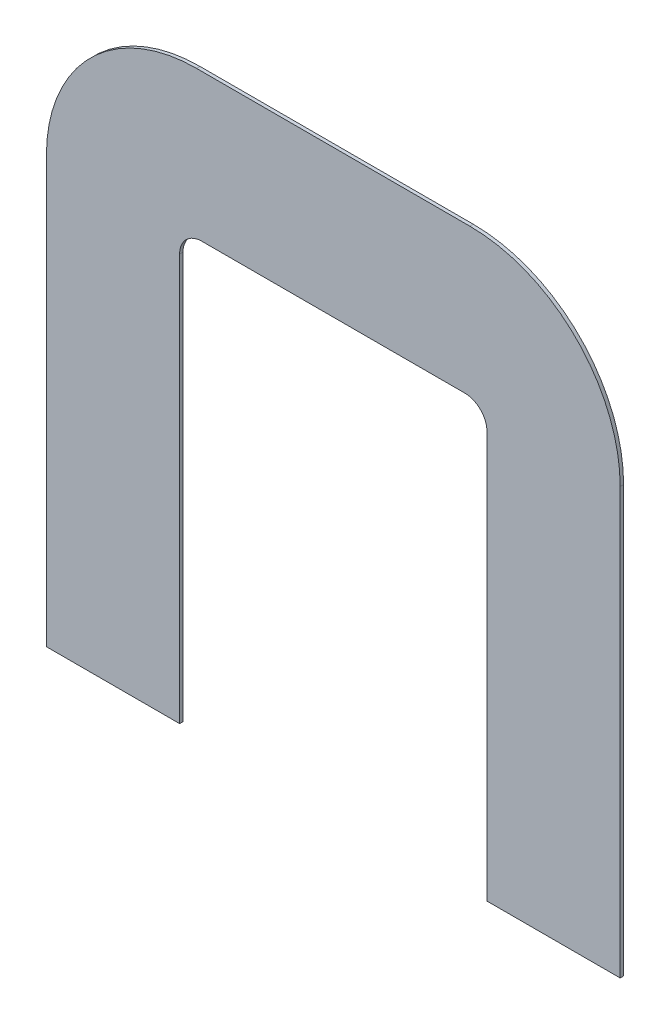
ISO-10303-21;
HEADER;
FILE_DESCRIPTION(('STEP AP214'),'2;1');
FILE_NAME('part.step','',(''),(''),'','','');
FILE_SCHEMA(('AUTOMOTIVE_DESIGN { 1 0 10303 214 1 1 1 1 }'));
ENDSEC;
DATA;
#1=APPLICATION_CONTEXT('core data for automotive mechanical design processes');
#2=APPLICATION_PROTOCOL_DEFINITION('international standard','automotive_design',2000,#1);
#3=PRODUCT_CONTEXT('',#1,'mechanical');
#4=PRODUCT('Part','Part','',(#3));
#5=PRODUCT_RELATED_PRODUCT_CATEGORY('part','',(#4));
#6=PRODUCT_DEFINITION_FORMATION('','',#4);
#7=PRODUCT_DEFINITION_CONTEXT('part definition',#1,'design');
#8=PRODUCT_DEFINITION('design','',#6,#7);
#9=PRODUCT_DEFINITION_SHAPE('','',#8);
#10=(LENGTH_UNIT() NAMED_UNIT(*) SI_UNIT(.MILLI.,.METRE.));
#11=(NAMED_UNIT(*) PLANE_ANGLE_UNIT() SI_UNIT($,.RADIAN.));
#12=(NAMED_UNIT(*) SI_UNIT($,.STERADIAN.) SOLID_ANGLE_UNIT());
#13=UNCERTAINTY_MEASURE_WITH_UNIT(LENGTH_MEASURE(1.E-05),#10,'distance_accuracy_value','');
#14=(GEOMETRIC_REPRESENTATION_CONTEXT(3) GLOBAL_UNCERTAINTY_ASSIGNED_CONTEXT((#13)) GLOBAL_UNIT_ASSIGNED_CONTEXT((#10,
#11,#12)) REPRESENTATION_CONTEXT('',''));
#15=CARTESIAN_POINT('',(0.,0.,0.));
#16=DIRECTION('',(0.,0.,1.));
#17=DIRECTION('',(1.,0.,0.));
#18=AXIS2_PLACEMENT_3D('',#15,#16,#17);
#19=CARTESIAN_POINT('',(2.164534045054,-16.64756050284,0.01));
#20=DIRECTION('',(0.,0.,1.));
#21=DIRECTION('',(1.,0.,0.));
#22=AXIS2_PLACEMENT_3D('',#19,#20,#21);
#23=PLANE('',#22);
#24=DIRECTION('',(0.,-1.,0.));
#25=VECTOR('',#24,1.);
#26=CARTESIAN_POINT('',(3.004534045054,-16.26704437193,0.01));
#27=LINE('',#26,#25);
#28=CARTESIAN_POINT('',(3.004534045054,-16.26704437193,0.01));
#29=VERTEX_POINT('',#28);
#30=CARTESIAN_POINT('',(3.004534045054,-17.5134,0.01));
#31=VERTEX_POINT('',#30);
#32=EDGE_CURVE('E385',#29,#31,#27,.T.);
#33=ORIENTED_EDGE('',*,*,#32,.F.);
#34=CARTESIAN_POINT('',(2.564534045054,-16.26704437193,0.01));
#35=DIRECTION('',(0.,0.,1.));
#36=DIRECTION('',(1.,0.,0.));
#37=AXIS2_PLACEMENT_3D('',#34,#35,#36);
#38=CIRCLE('',#37,0.44);
#39=CARTESIAN_POINT('',(2.564534045054,-15.82704437193,0.01));
#40=VERTEX_POINT('',#39);
#41=EDGE_CURVE('E11',#29,#40,#38,.T.);
#42=ORIENTED_EDGE('',*,*,#41,.T.);
#43=DIRECTION('',(1.,0.,0.));
#44=VECTOR('',#43,1.);
#45=CARTESIAN_POINT('',(1.764534045054,-15.82704437193,0.01));
#46=LINE('',#45,#44);
#47=CARTESIAN_POINT('',(1.764534045054,-15.82704437193,0.01));
#48=VERTEX_POINT('',#47);
#49=EDGE_CURVE('E220',#48,#40,#46,.T.);
#50=ORIENTED_EDGE('',*,*,#49,.F.);
#51=CARTESIAN_POINT('',(1.764534045054,-16.26704437193,0.01));
#52=DIRECTION('',(0.,0.,1.));
#53=DIRECTION('',(1.,0.,0.));
#54=AXIS2_PLACEMENT_3D('',#51,#52,#53);
#55=CIRCLE('',#54,0.44);
#56=CARTESIAN_POINT('',(1.324534045054,-16.26704437193,0.01));
#57=VERTEX_POINT('',#56);
#58=EDGE_CURVE('E217',#48,#57,#55,.T.);
#59=ORIENTED_EDGE('',*,*,#58,.T.);
#60=DIRECTION('',(0.,1.,0.));
#61=VECTOR('',#60,1.);
#62=CARTESIAN_POINT('',(1.324534045054,-17.5134,0.01));
#63=LINE('',#62,#61);
#64=CARTESIAN_POINT('',(1.324534045054,-17.5134,0.01));
#65=VERTEX_POINT('',#64);
#66=EDGE_CURVE('E201',#65,#57,#63,.T.);
#67=ORIENTED_EDGE('',*,*,#66,.F.);
#68=DIRECTION('',(-1.,0.,0.));
#69=VECTOR('',#68,1.);
#70=CARTESIAN_POINT('',(1.714534045054,-17.5134,0.01));
#71=LINE('',#70,#69);
#72=CARTESIAN_POINT('',(1.714534045054,-17.5134,0.01));
#73=VERTEX_POINT('',#72);
#74=EDGE_CURVE('E189',#73,#65,#71,.T.);
#75=ORIENTED_EDGE('',*,*,#74,.F.);
#76=DIRECTION('',(0.,-1.,0.));
#77=VECTOR('',#76,1.);
#78=CARTESIAN_POINT('',(1.714534045054,-16.32268295804,0.01));
#79=LINE('',#78,#77);
#80=CARTESIAN_POINT('',(1.714534045054,-16.32268295804,0.01));
#81=VERTEX_POINT('',#80);
#82=EDGE_CURVE('E180',#81,#73,#79,.T.);
#83=ORIENTED_EDGE('',*,*,#82,.F.);
#84=CARTESIAN_POINT('',(1.779534045054,-16.32268295804,0.01));
#85=DIRECTION('',(0.,0.,1.));
#86=DIRECTION('',(1.,0.,0.));
#87=AXIS2_PLACEMENT_3D('',#84,#85,#86);
#88=CIRCLE('',#87,0.065);
#89=CARTESIAN_POINT('',(1.779534045054,-16.25768295804,0.01));
#90=VERTEX_POINT('',#89);
#91=EDGE_CURVE('E137',#90,#81,#88,.T.);
#92=ORIENTED_EDGE('',*,*,#91,.F.);
#93=DIRECTION('',(-1.,0.,0.));
#94=VECTOR('',#93,1.);
#95=CARTESIAN_POINT('',(2.549534045054,-16.25768295804,0.01));
#96=LINE('',#95,#94);
#97=CARTESIAN_POINT('',(2.549534045054,-16.25768295804,0.01));
#98=VERTEX_POINT('',#97);
#99=EDGE_CURVE('E131',#98,#90,#96,.T.);
#100=ORIENTED_EDGE('',*,*,#99,.F.);
#101=CARTESIAN_POINT('',(2.549534045054,-16.32268295804,0.01));
#102=DIRECTION('',(0.,0.,1.));
#103=DIRECTION('',(1.,0.,0.));
#104=AXIS2_PLACEMENT_3D('',#101,#102,#103);
#105=CIRCLE('',#104,0.065);
#106=CARTESIAN_POINT('',(2.614534045054,-16.32268295804,0.01));
#107=VERTEX_POINT('',#106);
#108=EDGE_CURVE('E134',#107,#98,#105,.T.);
#109=ORIENTED_EDGE('',*,*,#108,.F.);
#110=DIRECTION('',(0.,1.,0.));
#111=VECTOR('',#110,1.);
#112=CARTESIAN_POINT('',(2.614534045054,-17.5134,0.01));
#113=LINE('',#112,#111);
#114=CARTESIAN_POINT('',(2.614534045054,-17.5134,0.01));
#115=VERTEX_POINT('',#114);
#116=EDGE_CURVE('E169',#115,#107,#113,.T.);
#117=ORIENTED_EDGE('',*,*,#116,.F.);
#118=DIRECTION('',(-1.,0.,0.));
#119=VECTOR('',#118,1.);
#120=CARTESIAN_POINT('',(3.004534045054,-17.5134,0.01));
#121=LINE('',#120,#119);
#122=EDGE_CURVE('E380',#31,#115,#121,.T.);
#123=ORIENTED_EDGE('',*,*,#122,.F.);
#124=EDGE_LOOP('',(#33,#42,#50,#59,#67,#75,#83,#92,#100,#109,#117,#123));
#125=FACE_BOUND('',#124,.T.);
#126=ADVANCED_FACE('F17',(#125),#23,.T.);
#127=CARTESIAN_POINT('',(2.164534045054,-16.64756050284,0.));
#128=DIRECTION('',(0.,0.,1.));
#129=DIRECTION('',(1.,0.,0.));
#130=AXIS2_PLACEMENT_3D('',#127,#128,#129);
#131=PLANE('',#130);
#132=DIRECTION('',(0.,-1.,0.));
#133=VECTOR('',#132,1.);
#134=CARTESIAN_POINT('',(3.004534045054,-16.26704437193,0.));
#135=LINE('',#134,#133);
#136=CARTESIAN_POINT('',(3.004534045054,-16.26704437193,0.));
#137=VERTEX_POINT('',#136);
#138=CARTESIAN_POINT('',(3.004534045054,-17.5134,0.));
#139=VERTEX_POINT('',#138);
#140=EDGE_CURVE('E374',#137,#139,#135,.T.);
#141=ORIENTED_EDGE('',*,*,#140,.T.);
#142=DIRECTION('',(-1.,0.,0.));
#143=VECTOR('',#142,1.);
#144=CARTESIAN_POINT('',(3.004534045054,-17.5134,0.));
#145=LINE('',#144,#143);
#146=CARTESIAN_POINT('',(2.614534045054,-17.5134,0.));
#147=VERTEX_POINT('',#146);
#148=EDGE_CURVE('E376',#139,#147,#145,.T.);
#149=ORIENTED_EDGE('',*,*,#148,.T.);
#150=DIRECTION('',(0.,1.,0.));
#151=VECTOR('',#150,1.);
#152=CARTESIAN_POINT('',(2.614534045054,-17.5134,0.));
#153=LINE('',#152,#151);
#154=CARTESIAN_POINT('',(2.614534045054,-16.32268295804,0.));
#155=VERTEX_POINT('',#154);
#156=EDGE_CURVE('E159',#147,#155,#153,.T.);
#157=ORIENTED_EDGE('',*,*,#156,.T.);
#158=CARTESIAN_POINT('',(2.549534045054,-16.32268295804,0.));
#159=DIRECTION('',(0.,0.,1.));
#160=DIRECTION('',(1.,0.,0.));
#161=AXIS2_PLACEMENT_3D('',#158,#159,#160);
#162=CIRCLE('',#161,0.065);
#163=CARTESIAN_POINT('',(2.549534045054,-16.25768295804,0.));
#164=VERTEX_POINT('',#163);
#165=EDGE_CURVE('E143',#155,#164,#162,.T.);
#166=ORIENTED_EDGE('',*,*,#165,.T.);
#167=DIRECTION('',(-1.,0.,0.));
#168=VECTOR('',#167,1.);
#169=CARTESIAN_POINT('',(2.549534045054,-16.25768295804,0.));
#170=LINE('',#169,#168);
#171=CARTESIAN_POINT('',(1.779534045054,-16.25768295804,0.));
#172=VERTEX_POINT('',#171);
#173=EDGE_CURVE('E149',#164,#172,#170,.T.);
#174=ORIENTED_EDGE('',*,*,#173,.T.);
#175=CARTESIAN_POINT('',(1.779534045054,-16.32268295804,0.));
#176=DIRECTION('',(0.,0.,1.));
#177=DIRECTION('',(1.,0.,0.));
#178=AXIS2_PLACEMENT_3D('',#175,#176,#177);
#179=CIRCLE('',#178,0.065);
#180=CARTESIAN_POINT('',(1.714534045054,-16.32268295804,0.));
#181=VERTEX_POINT('',#180);
#182=EDGE_CURVE('E176',#172,#181,#179,.T.);
#183=ORIENTED_EDGE('',*,*,#182,.T.);
#184=DIRECTION('',(0.,-1.,0.));
#185=VECTOR('',#184,1.);
#186=CARTESIAN_POINT('',(1.714534045054,-16.32268295804,0.));
#187=LINE('',#186,#185);
#188=CARTESIAN_POINT('',(1.714534045054,-17.5134,0.));
#189=VERTEX_POINT('',#188);
#190=EDGE_CURVE('E185',#181,#189,#187,.T.);
#191=ORIENTED_EDGE('',*,*,#190,.T.);
#192=DIRECTION('',(-1.,0.,0.));
#193=VECTOR('',#192,1.);
#194=CARTESIAN_POINT('',(1.714534045054,-17.5134,0.));
#195=LINE('',#194,#193);
#196=CARTESIAN_POINT('',(1.324534045054,-17.5134,0.));
#197=VERTEX_POINT('',#196);
#198=EDGE_CURVE('E197',#189,#197,#195,.T.);
#199=ORIENTED_EDGE('',*,*,#198,.T.);
#200=DIRECTION('',(0.,1.,0.));
#201=VECTOR('',#200,1.);
#202=CARTESIAN_POINT('',(1.324534045054,-17.5134,0.));
#203=LINE('',#202,#201);
#204=CARTESIAN_POINT('',(1.324534045054,-16.26704437193,0.));
#205=VERTEX_POINT('',#204);
#206=EDGE_CURVE('E209',#197,#205,#203,.T.);
#207=ORIENTED_EDGE('',*,*,#206,.T.);
#208=CARTESIAN_POINT('',(1.764534045054,-16.26704437193,0.));
#209=DIRECTION('',(0.,0.,1.));
#210=DIRECTION('',(1.,0.,0.));
#211=AXIS2_PLACEMENT_3D('',#208,#209,#210);
#212=CIRCLE('',#211,0.44);
#213=CARTESIAN_POINT('',(1.764534045054,-15.82704437193,0.));
#214=VERTEX_POINT('',#213);
#215=EDGE_CURVE('E214',#214,#205,#212,.T.);
#216=ORIENTED_EDGE('',*,*,#215,.F.);
#217=DIRECTION('',(1.,0.,0.));
#218=VECTOR('',#217,1.);
#219=CARTESIAN_POINT('',(1.764534045054,-15.82704437193,0.));
#220=LINE('',#219,#218);
#221=CARTESIAN_POINT('',(2.564534045054,-15.82704437193,0.));
#222=VERTEX_POINT('',#221);
#223=EDGE_CURVE('E227',#214,#222,#220,.T.);
#224=ORIENTED_EDGE('',*,*,#223,.T.);
#225=CARTESIAN_POINT('',(2.564534045054,-16.26704437193,0.));
#226=DIRECTION('',(0.,0.,1.));
#227=DIRECTION('',(1.,0.,0.));
#228=AXIS2_PLACEMENT_3D('',#225,#226,#227);
#229=CIRCLE('',#228,0.44);
#230=EDGE_CURVE('E25',#137,#222,#229,.T.);
#231=ORIENTED_EDGE('',*,*,#230,.F.);
#232=EDGE_LOOP('',(#141,#149,#157,#166,#174,#183,#191,#199,#207,#216,#224,#231));
#233=FACE_BOUND('',#232,.T.);
#234=ADVANCED_FACE('F337',(#233),#131,.F.);
#235=CARTESIAN_POINT('',(2.564534045054,-16.26704437193,0.));
#236=DIRECTION('',(0.,0.,-1.));
#237=DIRECTION('',(1.,0.,0.));
#238=AXIS2_PLACEMENT_3D('',#235,#236,#237);
#239=CYLINDRICAL_SURFACE('',#238,0.44);
#240=DIRECTION('',(0.,0.,1.));
#241=VECTOR('',#240,1.);
#242=CARTESIAN_POINT('',(3.004534045054,-16.26704437193,0.));
#243=LINE('',#242,#241);
#244=EDGE_CURVE('E392',#137,#29,#243,.T.);
#245=ORIENTED_EDGE('',*,*,#244,.F.);
#246=ORIENTED_EDGE('',*,*,#230,.T.);
#247=DIRECTION('',(0.,0.,1.));
#248=VECTOR('',#247,1.);
#249=CARTESIAN_POINT('',(2.564534045054,-15.82704437193,0.));
#250=LINE('',#249,#248);
#251=EDGE_CURVE('E224',#222,#40,#250,.T.);
#252=ORIENTED_EDGE('',*,*,#251,.T.);
#253=ORIENTED_EDGE('',*,*,#41,.F.);
#254=EDGE_LOOP('',(#245,#246,#252,#253));
#255=FACE_BOUND('',#254,.T.);
#256=ADVANCED_FACE('F314',(#255),#239,.T.);
#257=CARTESIAN_POINT('',(1.764534045054,-15.82704437193,0.));
#258=DIRECTION('',(0.,1.,0.));
#259=DIRECTION('',(1.,0.,0.));
#260=AXIS2_PLACEMENT_3D('',#257,#258,#259);
#261=PLANE('',#260);
#262=DIRECTION('',(0.,0.,1.));
#263=VECTOR('',#262,1.);
#264=CARTESIAN_POINT('',(1.764534045054,-15.82704437193,0.));
#265=LINE('',#264,#263);
#266=EDGE_CURVE('E210',#214,#48,#265,.T.);
#267=ORIENTED_EDGE('',*,*,#266,.T.);
#268=ORIENTED_EDGE('',*,*,#49,.T.);
#269=ORIENTED_EDGE('',*,*,#251,.F.);
#270=ORIENTED_EDGE('',*,*,#223,.F.);
#271=EDGE_LOOP('',(#267,#268,#269,#270));
#272=FACE_BOUND('',#271,.T.);
#273=ADVANCED_FACE('F297',(#272),#261,.T.);
#274=CARTESIAN_POINT('',(1.764534045054,-16.26704437193,0.));
#275=DIRECTION('',(0.,0.,-1.));
#276=DIRECTION('',(1.,0.,0.));
#277=AXIS2_PLACEMENT_3D('',#274,#275,#276);
#278=CYLINDRICAL_SURFACE('',#277,0.44);
#279=ORIENTED_EDGE('',*,*,#266,.F.);
#280=ORIENTED_EDGE('',*,*,#215,.T.);
#281=DIRECTION('',(0.,0.,1.));
#282=VECTOR('',#281,1.);
#283=CARTESIAN_POINT('',(1.324534045054,-16.26704437193,0.));
#284=LINE('',#283,#282);
#285=EDGE_CURVE('E205',#205,#57,#284,.T.);
#286=ORIENTED_EDGE('',*,*,#285,.T.);
#287=ORIENTED_EDGE('',*,*,#58,.F.);
#288=EDGE_LOOP('',(#279,#280,#286,#287));
#289=FACE_BOUND('',#288,.T.);
#290=ADVANCED_FACE('F291',(#289),#278,.T.);
#291=CARTESIAN_POINT('',(1.324534045054,-17.5134,0.));
#292=DIRECTION('',(-1.,0.,0.));
#293=DIRECTION('',(0.,0.,1.));
#294=AXIS2_PLACEMENT_3D('',#291,#292,#293);
#295=PLANE('',#294);
#296=DIRECTION('',(0.,0.,1.));
#297=VECTOR('',#296,1.);
#298=CARTESIAN_POINT('',(1.324534045054,-17.5134,0.));
#299=LINE('',#298,#297);
#300=EDGE_CURVE('E193',#197,#65,#299,.T.);
#301=ORIENTED_EDGE('',*,*,#300,.T.);
#302=ORIENTED_EDGE('',*,*,#66,.T.);
#303=ORIENTED_EDGE('',*,*,#285,.F.);
#304=ORIENTED_EDGE('',*,*,#206,.F.);
#305=EDGE_LOOP('',(#301,#302,#303,#304));
#306=FACE_BOUND('',#305,.T.);
#307=ADVANCED_FACE('F296',(#306),#295,.T.);
#308=CARTESIAN_POINT('',(1.714534045054,-17.5134,0.));
#309=DIRECTION('',(0.,-1.,0.));
#310=DIRECTION('',(0.,0.,-1.));
#311=AXIS2_PLACEMENT_3D('',#308,#309,#310);
#312=PLANE('',#311);
#313=DIRECTION('',(0.,0.,1.));
#314=VECTOR('',#313,1.);
#315=CARTESIAN_POINT('',(1.714534045054,-17.5134,0.));
#316=LINE('',#315,#314);
#317=EDGE_CURVE('E181',#189,#73,#316,.T.);
#318=ORIENTED_EDGE('',*,*,#317,.T.);
#319=ORIENTED_EDGE('',*,*,#74,.T.);
#320=ORIENTED_EDGE('',*,*,#300,.F.);
#321=ORIENTED_EDGE('',*,*,#198,.F.);
#322=EDGE_LOOP('',(#318,#319,#320,#321));
#323=FACE_BOUND('',#322,.T.);
#324=ADVANCED_FACE('F271',(#323),#312,.T.);
#325=CARTESIAN_POINT('',(1.714534045054,-16.32268295804,0.));
#326=DIRECTION('',(1.,0.,0.));
#327=DIRECTION('',(0.,1.,0.));
#328=AXIS2_PLACEMENT_3D('',#325,#326,#327);
#329=PLANE('',#328);
#330=DIRECTION('',(0.,0.,1.));
#331=VECTOR('',#330,1.);
#332=CARTESIAN_POINT('',(1.714534045054,-16.32268295804,0.));
#333=LINE('',#332,#331);
#334=EDGE_CURVE('E172',#181,#81,#333,.T.);
#335=ORIENTED_EDGE('',*,*,#334,.T.);
#336=ORIENTED_EDGE('',*,*,#82,.T.);
#337=ORIENTED_EDGE('',*,*,#317,.F.);
#338=ORIENTED_EDGE('',*,*,#190,.F.);
#339=EDGE_LOOP('',(#335,#336,#337,#338));
#340=FACE_BOUND('',#339,.T.);
#341=ADVANCED_FACE('F265',(#340),#329,.T.);
#342=CARTESIAN_POINT('',(1.779534045054,-16.32268295804,0.));
#343=DIRECTION('',(0.,0.,-1.));
#344=DIRECTION('',(1.,0.,0.));
#345=AXIS2_PLACEMENT_3D('',#342,#343,#344);
#346=CYLINDRICAL_SURFACE('',#345,0.065);
#347=DIRECTION('',(0.,0.,1.));
#348=VECTOR('',#347,1.);
#349=CARTESIAN_POINT('',(1.779534045054,-16.25768295804,0.));
#350=LINE('',#349,#348);
#351=EDGE_CURVE('E142',#172,#90,#350,.T.);
#352=ORIENTED_EDGE('',*,*,#351,.T.);
#353=ORIENTED_EDGE('',*,*,#91,.T.);
#354=ORIENTED_EDGE('',*,*,#334,.F.);
#355=ORIENTED_EDGE('',*,*,#182,.F.);
#356=EDGE_LOOP('',(#352,#353,#354,#355));
#357=FACE_BOUND('',#356,.T.);
#358=ADVANCED_FACE('F270',(#357),#346,.F.);
#359=CARTESIAN_POINT('',(2.549534045054,-16.25768295804,0.));
#360=DIRECTION('',(0.,-1.,0.));
#361=DIRECTION('',(0.,0.,-1.));
#362=AXIS2_PLACEMENT_3D('',#359,#360,#361);
#363=PLANE('',#362);
#364=DIRECTION('',(0.,0.,1.));
#365=VECTOR('',#364,1.);
#366=CARTESIAN_POINT('',(2.549534045054,-16.25768295804,0.));
#367=LINE('',#366,#365);
#368=EDGE_CURVE('E146',#164,#98,#367,.T.);
#369=ORIENTED_EDGE('',*,*,#368,.T.);
#370=ORIENTED_EDGE('',*,*,#99,.T.);
#371=ORIENTED_EDGE('',*,*,#351,.F.);
#372=ORIENTED_EDGE('',*,*,#173,.F.);
#373=EDGE_LOOP('',(#369,#370,#371,#372));
#374=FACE_BOUND('',#373,.T.);
#375=ADVANCED_FACE('F147',(#374),#363,.T.);
#376=CARTESIAN_POINT('',(2.549534045054,-16.32268295804,0.));
#377=DIRECTION('',(0.,0.,-1.));
#378=DIRECTION('',(1.,0.,0.));
#379=AXIS2_PLACEMENT_3D('',#376,#377,#378);
#380=CYLINDRICAL_SURFACE('',#379,0.065);
#381=DIRECTION('',(0.,0.,1.));
#382=VECTOR('',#381,1.);
#383=CARTESIAN_POINT('',(2.614534045054,-16.32268295804,0.));
#384=LINE('',#383,#382);
#385=EDGE_CURVE('E156',#155,#107,#384,.T.);
#386=ORIENTED_EDGE('',*,*,#385,.T.);
#387=ORIENTED_EDGE('',*,*,#108,.T.);
#388=ORIENTED_EDGE('',*,*,#368,.F.);
#389=ORIENTED_EDGE('',*,*,#165,.F.);
#390=EDGE_LOOP('',(#386,#387,#388,#389));
#391=FACE_BOUND('',#390,.T.);
#392=ADVANCED_FACE('F154',(#391),#380,.F.);
#393=CARTESIAN_POINT('',(2.614534045054,-17.5134,0.));
#394=DIRECTION('',(-1.,0.,0.));
#395=DIRECTION('',(0.,0.,1.));
#396=AXIS2_PLACEMENT_3D('',#393,#394,#395);
#397=PLANE('',#396);
#398=DIRECTION('',(0.,0.,1.));
#399=VECTOR('',#398,1.);
#400=CARTESIAN_POINT('',(2.614534045054,-17.5134,0.));
#401=LINE('',#400,#399);
#402=EDGE_CURVE('E397',#147,#115,#401,.T.);
#403=ORIENTED_EDGE('',*,*,#402,.T.);
#404=ORIENTED_EDGE('',*,*,#116,.T.);
#405=ORIENTED_EDGE('',*,*,#385,.F.);
#406=ORIENTED_EDGE('',*,*,#156,.F.);
#407=EDGE_LOOP('',(#403,#404,#405,#406));
#408=FACE_BOUND('',#407,.T.);
#409=ADVANCED_FACE('F236',(#408),#397,.T.);
#410=CARTESIAN_POINT('',(3.004534045054,-17.5134,0.));
#411=DIRECTION('',(0.,-1.,0.));
#412=DIRECTION('',(0.,0.,-1.));
#413=AXIS2_PLACEMENT_3D('',#410,#411,#412);
#414=PLANE('',#413);
#415=DIRECTION('',(0.,0.,1.));
#416=VECTOR('',#415,1.);
#417=CARTESIAN_POINT('',(3.004534045054,-17.5134,0.));
#418=LINE('',#417,#416);
#419=EDGE_CURVE('E381',#139,#31,#418,.T.);
#420=ORIENTED_EDGE('',*,*,#419,.T.);
#421=ORIENTED_EDGE('',*,*,#122,.T.);
#422=ORIENTED_EDGE('',*,*,#402,.F.);
#423=ORIENTED_EDGE('',*,*,#148,.F.);
#424=EDGE_LOOP('',(#420,#421,#422,#423));
#425=FACE_BOUND('',#424,.T.);
#426=ADVANCED_FACE('F241',(#425),#414,.T.);
#427=CARTESIAN_POINT('',(3.004534045054,-16.26704437193,0.));
#428=DIRECTION('',(1.,0.,0.));
#429=DIRECTION('',(0.,1.,0.));
#430=AXIS2_PLACEMENT_3D('',#427,#428,#429);
#431=PLANE('',#430);
#432=ORIENTED_EDGE('',*,*,#244,.T.);
#433=ORIENTED_EDGE('',*,*,#32,.T.);
#434=ORIENTED_EDGE('',*,*,#419,.F.);
#435=ORIENTED_EDGE('',*,*,#140,.F.);
#436=EDGE_LOOP('',(#432,#433,#434,#435));
#437=FACE_BOUND('',#436,.T.);
#438=ADVANCED_FACE('F249',(#437),#431,.T.);
#439=CLOSED_SHELL('',(#126,#234,#256,#273,#290,#307,#324,#341,#358,#375,#392,#409,#426,#438));
#440=MANIFOLD_SOLID_BREP('B1',#439);
#441=ADVANCED_BREP_SHAPE_REPRESENTATION('',(#18,#440),#14);
#442=SHAPE_DEFINITION_REPRESENTATION(#9,#441);
ENDSEC;
END-ISO-10303-21;
